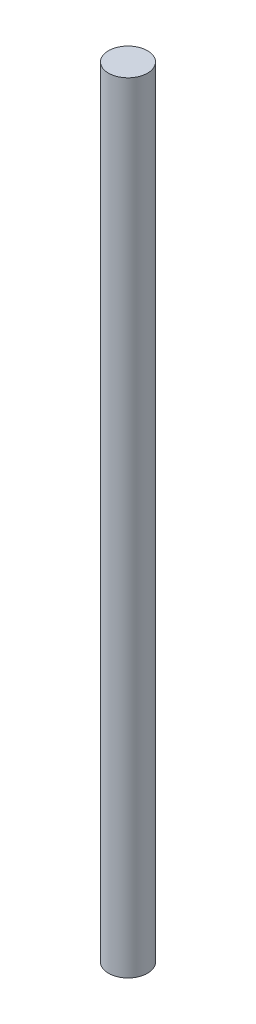
ISO-10303-21;
HEADER;
FILE_DESCRIPTION(('STEP AP214'),'2;1');
FILE_NAME('part.step','',(''),(''),'','','');
FILE_SCHEMA(('AUTOMOTIVE_DESIGN { 1 0 10303 214 1 1 1 1 }'));
ENDSEC;
DATA;
#1=APPLICATION_CONTEXT('core data for automotive mechanical design processes');
#2=APPLICATION_PROTOCOL_DEFINITION('international standard','automotive_design',2000,#1);
#3=PRODUCT_CONTEXT('',#1,'mechanical');
#4=PRODUCT('Part','Part','',(#3));
#5=PRODUCT_RELATED_PRODUCT_CATEGORY('part','',(#4));
#6=PRODUCT_DEFINITION_FORMATION('','',#4);
#7=PRODUCT_DEFINITION_CONTEXT('part definition',#1,'design');
#8=PRODUCT_DEFINITION('design','',#6,#7);
#9=PRODUCT_DEFINITION_SHAPE('','',#8);
#10=(LENGTH_UNIT() NAMED_UNIT(*) SI_UNIT(.MILLI.,.METRE.));
#11=(NAMED_UNIT(*) PLANE_ANGLE_UNIT() SI_UNIT($,.RADIAN.));
#12=(NAMED_UNIT(*) SI_UNIT($,.STERADIAN.) SOLID_ANGLE_UNIT());
#13=UNCERTAINTY_MEASURE_WITH_UNIT(LENGTH_MEASURE(1.E-05),#10,'distance_accuracy_value','');
#14=(GEOMETRIC_REPRESENTATION_CONTEXT(3) GLOBAL_UNCERTAINTY_ASSIGNED_CONTEXT((#13)) GLOBAL_UNIT_ASSIGNED_CONTEXT((#10,
#11,#12)) REPRESENTATION_CONTEXT('',''));
#15=CARTESIAN_POINT('',(0.,0.,0.));
#16=DIRECTION('',(0.,0.,1.));
#17=DIRECTION('',(1.,0.,0.));
#18=AXIS2_PLACEMENT_3D('',#15,#16,#17);
#19=CARTESIAN_POINT('',(0.,400.,0.));
#20=DIRECTION('',(0.,-1.,0.));
#21=DIRECTION('',(0.,0.,-1.));
#22=AXIS2_PLACEMENT_3D('',#19,#20,#21);
#23=CYLINDRICAL_SURFACE('',#22,10.);
#24=CARTESIAN_POINT('',(0.,400.,0.));
#25=DIRECTION('',(0.,1.,0.));
#26=DIRECTION('',(0.,0.,1.));
#27=AXIS2_PLACEMENT_3D('',#24,#25,#26);
#28=CIRCLE('',#27,10.);
#29=CARTESIAN_POINT('',(0.,400.,10.));
#30=VERTEX_POINT('',#29);
#31=EDGE_CURVE('E10',#30,#30,#28,.T.);
#32=ORIENTED_EDGE('',*,*,#31,.F.);
#33=EDGE_LOOP('',(#32));
#34=FACE_BOUND('',#33,.T.);
#35=CARTESIAN_POINT('',(0.,0.,0.));
#36=DIRECTION('',(0.,1.,0.));
#37=DIRECTION('',(0.,0.,1.));
#38=AXIS2_PLACEMENT_3D('',#35,#36,#37);
#39=CIRCLE('',#38,10.);
#40=CARTESIAN_POINT('',(0.,0.,10.));
#41=VERTEX_POINT('',#40);
#42=EDGE_CURVE('E30',#41,#41,#39,.T.);
#43=ORIENTED_EDGE('',*,*,#42,.T.);
#44=EDGE_LOOP('',(#43));
#45=FACE_BOUND('',#44,.T.);
#46=ADVANCED_FACE('F24',(#34,#45),#23,.T.);
#47=CARTESIAN_POINT('',(0.,400.,0.));
#48=DIRECTION('',(0.,1.,0.));
#49=DIRECTION('',(0.,0.,1.));
#50=AXIS2_PLACEMENT_3D('',#47,#48,#49);
#51=PLANE('',#50);
#52=ORIENTED_EDGE('',*,*,#31,.T.);
#53=EDGE_LOOP('',(#52));
#54=FACE_BOUND('',#53,.T.);
#55=ADVANCED_FACE('F39',(#54),#51,.T.);
#56=CARTESIAN_POINT('',(0.,0.,0.));
#57=DIRECTION('',(0.,1.,0.));
#58=DIRECTION('',(0.,0.,1.));
#59=AXIS2_PLACEMENT_3D('',#56,#57,#58);
#60=PLANE('',#59);
#61=ORIENTED_EDGE('',*,*,#42,.F.);
#62=EDGE_LOOP('',(#61));
#63=FACE_BOUND('',#62,.T.);
#64=ADVANCED_FACE('F37',(#63),#60,.F.);
#65=CLOSED_SHELL('',(#46,#55,#64));
#66=MANIFOLD_SOLID_BREP('B2',#65);
#67=ADVANCED_BREP_SHAPE_REPRESENTATION('',(#18,#66),#14);
#68=SHAPE_DEFINITION_REPRESENTATION(#9,#67);
ENDSEC;
END-ISO-10303-21;
